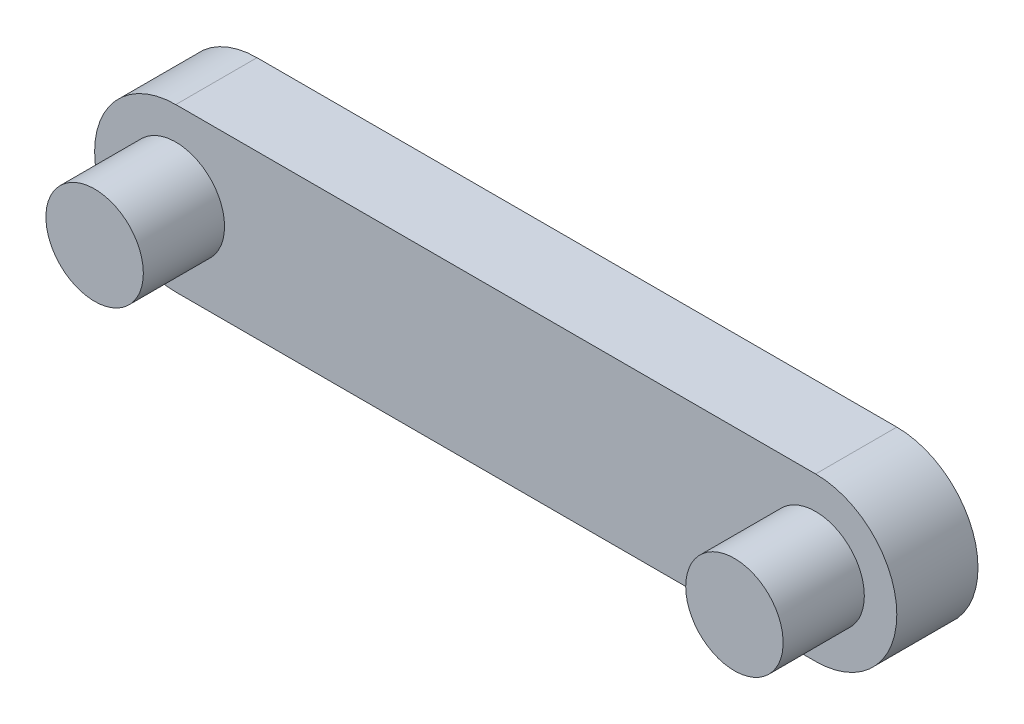
ISO-10303-21;
HEADER;
FILE_DESCRIPTION(('STEP AP214'),'2;1');
FILE_NAME('part.step','',(''),(''),'','','');
FILE_SCHEMA(('AUTOMOTIVE_DESIGN { 1 0 10303 214 1 1 1 1 }'));
ENDSEC;
DATA;
#1=APPLICATION_CONTEXT('core data for automotive mechanical design processes');
#2=APPLICATION_PROTOCOL_DEFINITION('international standard','automotive_design',2000,#1);
#3=PRODUCT_CONTEXT('',#1,'mechanical');
#4=PRODUCT('Part','Part','',(#3));
#5=PRODUCT_RELATED_PRODUCT_CATEGORY('part','',(#4));
#6=PRODUCT_DEFINITION_FORMATION('','',#4);
#7=PRODUCT_DEFINITION_CONTEXT('part definition',#1,'design');
#8=PRODUCT_DEFINITION('design','',#6,#7);
#9=PRODUCT_DEFINITION_SHAPE('','',#8);
#10=(LENGTH_UNIT() NAMED_UNIT(*) SI_UNIT(.MILLI.,.METRE.));
#11=(NAMED_UNIT(*) PLANE_ANGLE_UNIT() SI_UNIT($,.RADIAN.));
#12=(NAMED_UNIT(*) SI_UNIT($,.STERADIAN.) SOLID_ANGLE_UNIT());
#13=UNCERTAINTY_MEASURE_WITH_UNIT(LENGTH_MEASURE(1.E-05),#10,'distance_accuracy_value','');
#14=(GEOMETRIC_REPRESENTATION_CONTEXT(3) GLOBAL_UNCERTAINTY_ASSIGNED_CONTEXT((#13)) GLOBAL_UNIT_ASSIGNED_CONTEXT((#10,
#11,#12)) REPRESENTATION_CONTEXT('',''));
#15=CARTESIAN_POINT('',(0.,0.,0.));
#16=DIRECTION('',(0.,0.,1.));
#17=DIRECTION('',(1.,0.,0.));
#18=AXIS2_PLACEMENT_3D('',#15,#16,#17);
#19=CARTESIAN_POINT('',(19.7,0.,5.));
#20=DIRECTION('',(0.,0.,1.));
#21=DIRECTION('',(1.,0.,0.));
#22=AXIS2_PLACEMENT_3D('',#19,#20,#21);
#23=PLANE('',#22);
#24=CARTESIAN_POINT('',(-19.7,0.,5.));
#25=DIRECTION('',(0.,0.,1.));
#26=DIRECTION('',(1.,0.,0.));
#27=AXIS2_PLACEMENT_3D('',#24,#25,#26);
#28=CIRCLE('',#27,3.);
#29=CARTESIAN_POINT('',(-16.7,0.,5.));
#30=VERTEX_POINT('',#29);
#31=EDGE_CURVE('E114',#30,#30,#28,.T.);
#32=ORIENTED_EDGE('',*,*,#31,.F.);
#33=EDGE_LOOP('',(#32));
#34=FACE_BOUND('',#33,.T.);
#35=CARTESIAN_POINT('',(19.7,0.,5.));
#36=DIRECTION('',(0.,0.,1.));
#37=DIRECTION('',(1.,0.,0.));
#38=AXIS2_PLACEMENT_3D('',#35,#36,#37);
#39=CIRCLE('',#38,5.);
#40=CARTESIAN_POINT('',(19.7,-4.99999999999999,5.));
#41=VERTEX_POINT('',#40);
#42=CARTESIAN_POINT('',(19.7,5.00000000000001,5.));
#43=VERTEX_POINT('',#42);
#44=EDGE_CURVE('E85',#41,#43,#39,.T.);
#45=ORIENTED_EDGE('',*,*,#44,.T.);
#46=DIRECTION('',(-1.,0.,0.));
#47=VECTOR('',#46,1.);
#48=CARTESIAN_POINT('',(19.7,5.00000000000001,5.));
#49=LINE('',#48,#47);
#50=CARTESIAN_POINT('',(-19.7,5.,5.));
#51=VERTEX_POINT('',#50);
#52=EDGE_CURVE('E80',#43,#51,#49,.T.);
#53=ORIENTED_EDGE('',*,*,#52,.T.);
#54=CARTESIAN_POINT('',(-19.7,0.,5.));
#55=DIRECTION('',(0.,0.,1.));
#56=DIRECTION('',(1.,0.,0.));
#57=AXIS2_PLACEMENT_3D('',#54,#55,#56);
#58=CIRCLE('',#57,5.);
#59=CARTESIAN_POINT('',(-19.7,-5.00000000000001,5.));
#60=VERTEX_POINT('',#59);
#61=EDGE_CURVE('E83',#51,#60,#58,.T.);
#62=ORIENTED_EDGE('',*,*,#61,.T.);
#63=DIRECTION('',(1.,0.,0.));
#64=VECTOR('',#63,1.);
#65=CARTESIAN_POINT('',(19.7,-4.99999999999999,5.));
#66=LINE('',#65,#64);
#67=EDGE_CURVE('E50',#60,#41,#66,.T.);
#68=ORIENTED_EDGE('',*,*,#67,.T.);
#69=EDGE_LOOP('',(#45,#53,#62,#68));
#70=FACE_BOUND('',#69,.T.);
#71=CARTESIAN_POINT('',(19.7,0.,5.));
#72=DIRECTION('',(0.,0.,1.));
#73=DIRECTION('',(1.,0.,0.));
#74=AXIS2_PLACEMENT_3D('',#71,#72,#73);
#75=CIRCLE('',#74,3.);
#76=CARTESIAN_POINT('',(22.7,0.,5.));
#77=VERTEX_POINT('',#76);
#78=EDGE_CURVE('E100',#77,#77,#75,.T.);
#79=ORIENTED_EDGE('',*,*,#78,.F.);
#80=EDGE_LOOP('',(#79));
#81=FACE_BOUND('',#80,.T.);
#82=ADVANCED_FACE('F33',(#34,#70,#81),#23,.T.);
#83=CARTESIAN_POINT('',(19.7,0.,0.));
#84=DIRECTION('',(0.,0.,1.));
#85=DIRECTION('',(1.,0.,0.));
#86=AXIS2_PLACEMENT_3D('',#83,#84,#85);
#87=PLANE('',#86);
#88=CARTESIAN_POINT('',(19.7,0.,0.));
#89=DIRECTION('',(0.,0.,1.));
#90=DIRECTION('',(1.,0.,0.));
#91=AXIS2_PLACEMENT_3D('',#88,#89,#90);
#92=CIRCLE('',#91,5.);
#93=CARTESIAN_POINT('',(19.7,-4.99999999999999,0.));
#94=VERTEX_POINT('',#93);
#95=CARTESIAN_POINT('',(19.7,5.00000000000001,0.));
#96=VERTEX_POINT('',#95);
#97=EDGE_CURVE('E97',#94,#96,#92,.T.);
#98=ORIENTED_EDGE('',*,*,#97,.F.);
#99=DIRECTION('',(1.,0.,0.));
#100=VECTOR('',#99,1.);
#101=CARTESIAN_POINT('',(19.7,-4.99999999999999,0.));
#102=LINE('',#101,#100);
#103=CARTESIAN_POINT('',(-19.7,-5.00000000000001,0.));
#104=VERTEX_POINT('',#103);
#105=EDGE_CURVE('E73',#104,#94,#102,.T.);
#106=ORIENTED_EDGE('',*,*,#105,.F.);
#107=CARTESIAN_POINT('',(-19.7,0.,0.));
#108=DIRECTION('',(0.,0.,1.));
#109=DIRECTION('',(1.,0.,0.));
#110=AXIS2_PLACEMENT_3D('',#107,#108,#109);
#111=CIRCLE('',#110,5.);
#112=CARTESIAN_POINT('',(-19.7,5.,0.));
#113=VERTEX_POINT('',#112);
#114=EDGE_CURVE('E67',#113,#104,#111,.T.);
#115=ORIENTED_EDGE('',*,*,#114,.F.);
#116=DIRECTION('',(-1.,0.,0.));
#117=VECTOR('',#116,1.);
#118=CARTESIAN_POINT('',(19.7,5.00000000000001,0.));
#119=LINE('',#118,#117);
#120=EDGE_CURVE('E89',#96,#113,#119,.T.);
#121=ORIENTED_EDGE('',*,*,#120,.F.);
#122=EDGE_LOOP('',(#98,#106,#115,#121));
#123=FACE_BOUND('',#122,.T.);
#124=ADVANCED_FACE('F108',(#123),#87,.F.);
#125=CARTESIAN_POINT('',(19.7,0.,5.));
#126=DIRECTION('',(0.,0.,-1.));
#127=DIRECTION('',(-1.,0.,0.));
#128=AXIS2_PLACEMENT_3D('',#125,#126,#127);
#129=CYLINDRICAL_SURFACE('',#128,5.);
#130=ORIENTED_EDGE('',*,*,#97,.T.);
#131=DIRECTION('',(0.,0.,-1.));
#132=VECTOR('',#131,1.);
#133=CARTESIAN_POINT('',(19.7,5.00000000000001,5.));
#134=LINE('',#133,#132);
#135=EDGE_CURVE('E11',#43,#96,#134,.T.);
#136=ORIENTED_EDGE('',*,*,#135,.F.);
#137=ORIENTED_EDGE('',*,*,#44,.F.);
#138=DIRECTION('',(0.,0.,-1.));
#139=VECTOR('',#138,1.);
#140=CARTESIAN_POINT('',(19.7,-4.99999999999999,5.));
#141=LINE('',#140,#139);
#142=EDGE_CURVE('E93',#41,#94,#141,.T.);
#143=ORIENTED_EDGE('',*,*,#142,.T.);
#144=EDGE_LOOP('',(#130,#136,#137,#143));
#145=FACE_BOUND('',#144,.T.);
#146=ADVANCED_FACE('F35',(#145),#129,.T.);
#147=CARTESIAN_POINT('',(19.7,5.00000000000001,5.));
#148=DIRECTION('',(0.,-1.,0.));
#149=DIRECTION('',(1.,0.,0.));
#150=AXIS2_PLACEMENT_3D('',#147,#148,#149);
#151=PLANE('',#150);
#152=ORIENTED_EDGE('',*,*,#120,.T.);
#153=DIRECTION('',(0.,0.,-1.));
#154=VECTOR('',#153,1.);
#155=CARTESIAN_POINT('',(-19.7,5.,5.));
#156=LINE('',#155,#154);
#157=EDGE_CURVE('E42',#51,#113,#156,.T.);
#158=ORIENTED_EDGE('',*,*,#157,.F.);
#159=ORIENTED_EDGE('',*,*,#52,.F.);
#160=ORIENTED_EDGE('',*,*,#135,.T.);
#161=EDGE_LOOP('',(#152,#158,#159,#160));
#162=FACE_BOUND('',#161,.T.);
#163=ADVANCED_FACE('F88',(#162),#151,.F.);
#164=CARTESIAN_POINT('',(-19.7,0.,5.));
#165=DIRECTION('',(0.,0.,-1.));
#166=DIRECTION('',(-1.,0.,0.));
#167=AXIS2_PLACEMENT_3D('',#164,#165,#166);
#168=CYLINDRICAL_SURFACE('',#167,5.);
#169=ORIENTED_EDGE('',*,*,#114,.T.);
#170=DIRECTION('',(0.,0.,-1.));
#171=VECTOR('',#170,1.);
#172=CARTESIAN_POINT('',(-19.7,-5.00000000000001,5.));
#173=LINE('',#172,#171);
#174=EDGE_CURVE('E90',#60,#104,#173,.T.);
#175=ORIENTED_EDGE('',*,*,#174,.F.);
#176=ORIENTED_EDGE('',*,*,#61,.F.);
#177=ORIENTED_EDGE('',*,*,#157,.T.);
#178=EDGE_LOOP('',(#169,#175,#176,#177));
#179=FACE_BOUND('',#178,.T.);
#180=ADVANCED_FACE('F91',(#179),#168,.T.);
#181=CARTESIAN_POINT('',(19.7,-4.99999999999999,5.));
#182=DIRECTION('',(0.,1.,0.));
#183=DIRECTION('',(-1.,0.,0.));
#184=AXIS2_PLACEMENT_3D('',#181,#182,#183);
#185=PLANE('',#184);
#186=ORIENTED_EDGE('',*,*,#105,.T.);
#187=ORIENTED_EDGE('',*,*,#142,.F.);
#188=ORIENTED_EDGE('',*,*,#67,.F.);
#189=ORIENTED_EDGE('',*,*,#174,.T.);
#190=EDGE_LOOP('',(#186,#187,#188,#189));
#191=FACE_BOUND('',#190,.T.);
#192=ADVANCED_FACE('F105',(#191),#185,.F.);
#193=CARTESIAN_POINT('',(-19.7,0.,10.));
#194=DIRECTION('',(0.,0.,-1.));
#195=DIRECTION('',(-1.,0.,0.));
#196=AXIS2_PLACEMENT_3D('',#193,#194,#195);
#197=CYLINDRICAL_SURFACE('',#196,3.);
#198=CARTESIAN_POINT('',(-19.7,0.,10.));
#199=DIRECTION('',(0.,0.,1.));
#200=DIRECTION('',(1.,0.,0.));
#201=AXIS2_PLACEMENT_3D('',#198,#199,#200);
#202=CIRCLE('',#201,3.);
#203=CARTESIAN_POINT('',(-16.7,0.,10.));
#204=VERTEX_POINT('',#203);
#205=EDGE_CURVE('E113',#204,#204,#202,.T.);
#206=ORIENTED_EDGE('',*,*,#205,.F.);
#207=EDGE_LOOP('',(#206));
#208=FACE_BOUND('',#207,.T.);
#209=ORIENTED_EDGE('',*,*,#31,.T.);
#210=EDGE_LOOP('',(#209));
#211=FACE_BOUND('',#210,.T.);
#212=ADVANCED_FACE('F143',(#208,#211),#197,.T.);
#213=CARTESIAN_POINT('',(-19.7,0.,10.));
#214=DIRECTION('',(0.,0.,1.));
#215=DIRECTION('',(1.,0.,0.));
#216=AXIS2_PLACEMENT_3D('',#213,#214,#215);
#217=PLANE('',#216);
#218=ORIENTED_EDGE('',*,*,#205,.T.);
#219=EDGE_LOOP('',(#218));
#220=FACE_BOUND('',#219,.T.);
#221=ADVANCED_FACE('F131',(#220),#217,.T.);
#222=CARTESIAN_POINT('',(19.7,0.,10.));
#223=DIRECTION('',(0.,0.,-1.));
#224=DIRECTION('',(-1.,0.,0.));
#225=AXIS2_PLACEMENT_3D('',#222,#223,#224);
#226=CYLINDRICAL_SURFACE('',#225,3.);
#227=ORIENTED_EDGE('',*,*,#78,.T.);
#228=EDGE_LOOP('',(#227));
#229=FACE_BOUND('',#228,.T.);
#230=CARTESIAN_POINT('',(19.7,0.,10.));
#231=DIRECTION('',(0.,0.,-1.));
#232=DIRECTION('',(-1.,0.,0.));
#233=AXIS2_PLACEMENT_3D('',#230,#231,#232);
#234=CIRCLE('',#233,3.);
#235=CARTESIAN_POINT('',(16.7,0.,10.));
#236=VERTEX_POINT('',#235);
#237=EDGE_CURVE('E117',#236,#236,#234,.T.);
#238=ORIENTED_EDGE('',*,*,#237,.T.);
#239=EDGE_LOOP('',(#238));
#240=FACE_BOUND('',#239,.T.);
#241=ADVANCED_FACE('F123',(#229,#240),#226,.T.);
#242=CARTESIAN_POINT('',(19.7,0.,10.));
#243=DIRECTION('',(0.,0.,-1.));
#244=DIRECTION('',(-1.,0.,0.));
#245=AXIS2_PLACEMENT_3D('',#242,#243,#244);
#246=PLANE('',#245);
#247=ORIENTED_EDGE('',*,*,#237,.F.);
#248=EDGE_LOOP('',(#247));
#249=FACE_BOUND('',#248,.T.);
#250=ADVANCED_FACE('F125',(#249),#246,.F.);
#251=CLOSED_SHELL('',(#82,#124,#146,#163,#180,#192,#212,#221,#241,#250));
#252=MANIFOLD_SOLID_BREP('B2',#251);
#253=ADVANCED_BREP_SHAPE_REPRESENTATION('',(#18,#252),#14);
#254=SHAPE_DEFINITION_REPRESENTATION(#9,#253);
ENDSEC;
END-ISO-10303-21;
